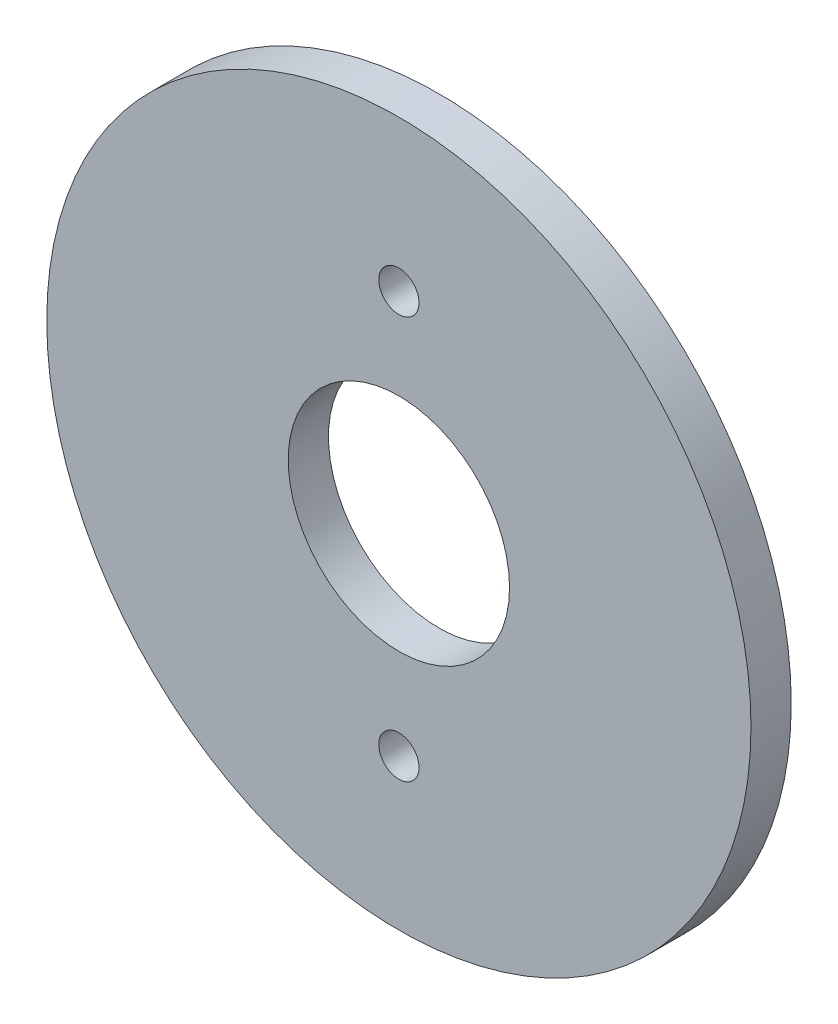
ISO-10303-21;
HEADER;
FILE_DESCRIPTION(('STEP AP214'),'2;1');
FILE_NAME('part.step','',(''),(''),'','','');
FILE_SCHEMA(('AUTOMOTIVE_DESIGN { 1 0 10303 214 1 1 1 1 }'));
ENDSEC;
DATA;
#1=APPLICATION_CONTEXT('core data for automotive mechanical design processes');
#2=APPLICATION_PROTOCOL_DEFINITION('international standard','automotive_design',2000,#1);
#3=PRODUCT_CONTEXT('',#1,'mechanical');
#4=PRODUCT('Part','Part','',(#3));
#5=PRODUCT_RELATED_PRODUCT_CATEGORY('part','',(#4));
#6=PRODUCT_DEFINITION_FORMATION('','',#4);
#7=PRODUCT_DEFINITION_CONTEXT('part definition',#1,'design');
#8=PRODUCT_DEFINITION('design','',#6,#7);
#9=PRODUCT_DEFINITION_SHAPE('','',#8);
#10=(LENGTH_UNIT() NAMED_UNIT(*) SI_UNIT(.MILLI.,.METRE.));
#11=(NAMED_UNIT(*) PLANE_ANGLE_UNIT() SI_UNIT($,.RADIAN.));
#12=(NAMED_UNIT(*) SI_UNIT($,.STERADIAN.) SOLID_ANGLE_UNIT());
#13=UNCERTAINTY_MEASURE_WITH_UNIT(LENGTH_MEASURE(1.E-05),#10,'distance_accuracy_value','');
#14=(GEOMETRIC_REPRESENTATION_CONTEXT(3) GLOBAL_UNCERTAINTY_ASSIGNED_CONTEXT((#13)) GLOBAL_UNIT_ASSIGNED_CONTEXT((#10,
#11,#12)) REPRESENTATION_CONTEXT('',''));
#15=CARTESIAN_POINT('',(0.,0.,0.));
#16=DIRECTION('',(0.,0.,1.));
#17=DIRECTION('',(1.,0.,0.));
#18=AXIS2_PLACEMENT_3D('',#15,#16,#17);
#19=CARTESIAN_POINT('',(0.,0.,2.));
#20=DIRECTION('',(0.,0.,1.));
#21=DIRECTION('',(1.,0.,0.));
#22=AXIS2_PLACEMENT_3D('',#19,#20,#21);
#23=PLANE('',#22);
#24=CARTESIAN_POINT('',(0.,10.,2.));
#25=DIRECTION('',(0.,0.,1.));
#26=DIRECTION('',(1.,0.,0.));
#27=AXIS2_PLACEMENT_3D('',#24,#25,#26);
#28=CIRCLE('',#27,1.);
#29=CARTESIAN_POINT('',(1.,10.,2.));
#30=VERTEX_POINT('',#29);
#31=EDGE_CURVE('E47',#30,#30,#28,.T.);
#32=ORIENTED_EDGE('',*,*,#31,.F.);
#33=EDGE_LOOP('',(#32));
#34=FACE_BOUND('',#33,.T.);
#35=CARTESIAN_POINT('',(0.,0.,2.));
#36=DIRECTION('',(0.,0.,1.));
#37=DIRECTION('',(1.,0.,0.));
#38=AXIS2_PLACEMENT_3D('',#35,#36,#37);
#39=CIRCLE('',#38,17.5);
#40=CARTESIAN_POINT('',(17.5,0.,2.));
#41=VERTEX_POINT('',#40);
#42=EDGE_CURVE('E10',#41,#41,#39,.T.);
#43=ORIENTED_EDGE('',*,*,#42,.T.);
#44=EDGE_LOOP('',(#43));
#45=FACE_BOUND('',#44,.T.);
#46=CARTESIAN_POINT('',(0.,0.,2.));
#47=DIRECTION('',(0.,0.,1.));
#48=DIRECTION('',(1.,0.,0.));
#49=AXIS2_PLACEMENT_3D('',#46,#47,#48);
#50=CIRCLE('',#49,5.5);
#51=CARTESIAN_POINT('',(5.5,0.,2.));
#52=VERTEX_POINT('',#51);
#53=EDGE_CURVE('E42',#52,#52,#50,.T.);
#54=ORIENTED_EDGE('',*,*,#53,.F.);
#55=EDGE_LOOP('',(#54));
#56=FACE_BOUND('',#55,.T.);
#57=CARTESIAN_POINT('',(0.,-10.,2.));
#58=DIRECTION('',(0.,0.,1.));
#59=DIRECTION('',(1.,0.,0.));
#60=AXIS2_PLACEMENT_3D('',#57,#58,#59);
#61=CIRCLE('',#60,1.);
#62=CARTESIAN_POINT('',(1.,-10.,2.));
#63=VERTEX_POINT('',#62);
#64=EDGE_CURVE('E53',#63,#63,#61,.T.);
#65=ORIENTED_EDGE('',*,*,#64,.F.);
#66=EDGE_LOOP('',(#65));
#67=FACE_BOUND('',#66,.T.);
#68=ADVANCED_FACE('F31',(#34,#45,#56,#67),#23,.T.);
#69=CARTESIAN_POINT('',(0.,0.,0.));
#70=DIRECTION('',(0.,0.,1.));
#71=DIRECTION('',(1.,0.,0.));
#72=AXIS2_PLACEMENT_3D('',#69,#70,#71);
#73=PLANE('',#72);
#74=CARTESIAN_POINT('',(0.,10.,0.));
#75=DIRECTION('',(0.,0.,1.));
#76=DIRECTION('',(1.,0.,0.));
#77=AXIS2_PLACEMENT_3D('',#74,#75,#76);
#78=CIRCLE('',#77,1.);
#79=CARTESIAN_POINT('',(1.,10.,0.));
#80=VERTEX_POINT('',#79);
#81=EDGE_CURVE('E50',#80,#80,#78,.T.);
#82=ORIENTED_EDGE('',*,*,#81,.T.);
#83=EDGE_LOOP('',(#82));
#84=FACE_BOUND('',#83,.T.);
#85=CARTESIAN_POINT('',(0.,0.,0.));
#86=DIRECTION('',(0.,0.,1.));
#87=DIRECTION('',(1.,0.,0.));
#88=AXIS2_PLACEMENT_3D('',#85,#86,#87);
#89=CIRCLE('',#88,17.5);
#90=CARTESIAN_POINT('',(17.5,0.,0.));
#91=VERTEX_POINT('',#90);
#92=EDGE_CURVE('E35',#91,#91,#89,.T.);
#93=ORIENTED_EDGE('',*,*,#92,.F.);
#94=EDGE_LOOP('',(#93));
#95=FACE_BOUND('',#94,.T.);
#96=CARTESIAN_POINT('',(0.,0.,0.));
#97=DIRECTION('',(0.,0.,1.));
#98=DIRECTION('',(1.,0.,0.));
#99=AXIS2_PLACEMENT_3D('',#96,#97,#98);
#100=CIRCLE('',#99,5.5);
#101=CARTESIAN_POINT('',(5.5,0.,0.));
#102=VERTEX_POINT('',#101);
#103=EDGE_CURVE('E44',#102,#102,#100,.T.);
#104=ORIENTED_EDGE('',*,*,#103,.T.);
#105=EDGE_LOOP('',(#104));
#106=FACE_BOUND('',#105,.T.);
#107=CARTESIAN_POINT('',(0.,-10.,0.));
#108=DIRECTION('',(0.,0.,1.));
#109=DIRECTION('',(1.,0.,0.));
#110=AXIS2_PLACEMENT_3D('',#107,#108,#109);
#111=CIRCLE('',#110,1.);
#112=CARTESIAN_POINT('',(1.,-10.,0.));
#113=VERTEX_POINT('',#112);
#114=EDGE_CURVE('E56',#113,#113,#111,.T.);
#115=ORIENTED_EDGE('',*,*,#114,.T.);
#116=EDGE_LOOP('',(#115));
#117=FACE_BOUND('',#116,.T.);
#118=ADVANCED_FACE('F66',(#84,#95,#106,#117),#73,.F.);
#119=CARTESIAN_POINT('',(0.,0.,2.));
#120=DIRECTION('',(0.,0.,-1.));
#121=DIRECTION('',(-1.,0.,0.));
#122=AXIS2_PLACEMENT_3D('',#119,#120,#121);
#123=CYLINDRICAL_SURFACE('',#122,17.5);
#124=ORIENTED_EDGE('',*,*,#42,.F.);
#125=EDGE_LOOP('',(#124));
#126=FACE_BOUND('',#125,.T.);
#127=ORIENTED_EDGE('',*,*,#92,.T.);
#128=EDGE_LOOP('',(#127));
#129=FACE_BOUND('',#128,.T.);
#130=ADVANCED_FACE('F33',(#126,#129),#123,.T.);
#131=CARTESIAN_POINT('',(0.,0.,2.));
#132=DIRECTION('',(0.,0.,-1.));
#133=DIRECTION('',(-1.,0.,0.));
#134=AXIS2_PLACEMENT_3D('',#131,#132,#133);
#135=CYLINDRICAL_SURFACE('',#134,5.5);
#136=ORIENTED_EDGE('',*,*,#53,.T.);
#137=EDGE_LOOP('',(#136));
#138=FACE_BOUND('',#137,.T.);
#139=ORIENTED_EDGE('',*,*,#103,.F.);
#140=EDGE_LOOP('',(#139));
#141=FACE_BOUND('',#140,.T.);
#142=ADVANCED_FACE('F75',(#138,#141),#135,.F.);
#143=CARTESIAN_POINT('',(0.,10.,2.));
#144=DIRECTION('',(0.,0.,-1.));
#145=DIRECTION('',(-1.,0.,0.));
#146=AXIS2_PLACEMENT_3D('',#143,#144,#145);
#147=CYLINDRICAL_SURFACE('',#146,1.);
#148=ORIENTED_EDGE('',*,*,#31,.T.);
#149=EDGE_LOOP('',(#148));
#150=FACE_BOUND('',#149,.T.);
#151=ORIENTED_EDGE('',*,*,#81,.F.);
#152=EDGE_LOOP('',(#151));
#153=FACE_BOUND('',#152,.T.);
#154=ADVANCED_FACE('F78',(#150,#153),#147,.F.);
#155=CARTESIAN_POINT('',(0.,-10.,2.));
#156=DIRECTION('',(0.,0.,-1.));
#157=DIRECTION('',(-1.,0.,0.));
#158=AXIS2_PLACEMENT_3D('',#155,#156,#157);
#159=CYLINDRICAL_SURFACE('',#158,1.);
#160=ORIENTED_EDGE('',*,*,#64,.T.);
#161=EDGE_LOOP('',(#160));
#162=FACE_BOUND('',#161,.T.);
#163=ORIENTED_EDGE('',*,*,#114,.F.);
#164=EDGE_LOOP('',(#163));
#165=FACE_BOUND('',#164,.T.);
#166=ADVANCED_FACE('F62',(#162,#165),#159,.F.);
#167=CLOSED_SHELL('',(#68,#118,#130,#142,#154,#166));
#168=MANIFOLD_SOLID_BREP('B2',#167);
#169=ADVANCED_BREP_SHAPE_REPRESENTATION('',(#18,#168),#14);
#170=SHAPE_DEFINITION_REPRESENTATION(#9,#169);
ENDSEC;
END-ISO-10303-21;
